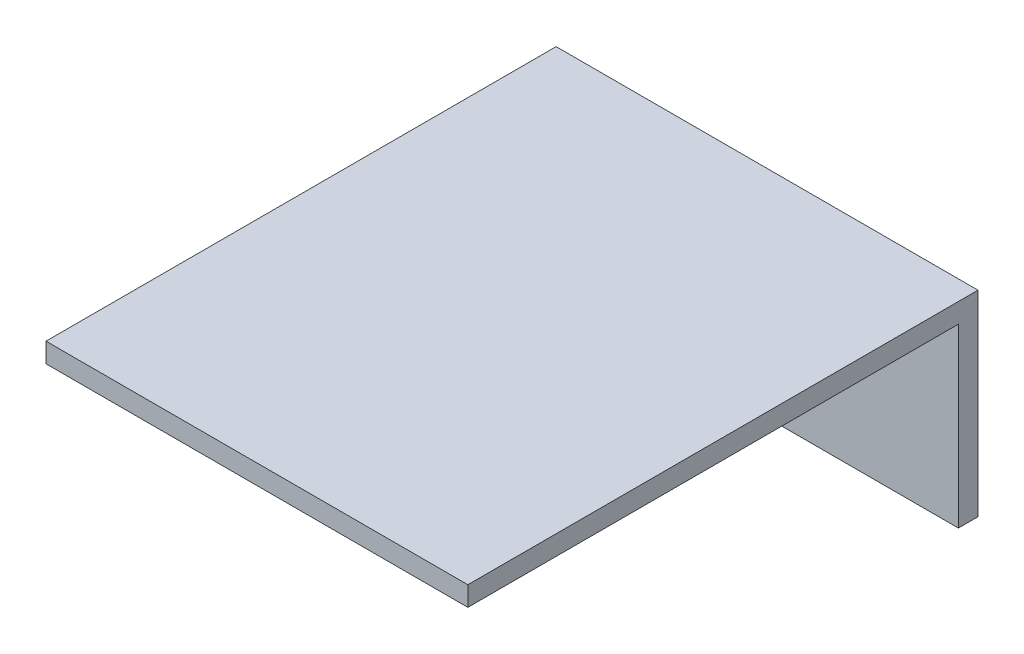
ISO-10303-21;
HEADER;
FILE_DESCRIPTION(('STEP AP214'),'2;1');
FILE_NAME('part.step','',(''),(''),'','','');
FILE_SCHEMA(('AUTOMOTIVE_DESIGN { 1 0 10303 214 1 1 1 1 }'));
ENDSEC;
DATA;
#1=APPLICATION_CONTEXT('core data for automotive mechanical design processes');
#2=APPLICATION_PROTOCOL_DEFINITION('international standard','automotive_design',2000,#1);
#3=PRODUCT_CONTEXT('',#1,'mechanical');
#4=PRODUCT('Part','Part','',(#3));
#5=PRODUCT_RELATED_PRODUCT_CATEGORY('part','',(#4));
#6=PRODUCT_DEFINITION_FORMATION('','',#4);
#7=PRODUCT_DEFINITION_CONTEXT('part definition',#1,'design');
#8=PRODUCT_DEFINITION('design','',#6,#7);
#9=PRODUCT_DEFINITION_SHAPE('','',#8);
#10=(LENGTH_UNIT() NAMED_UNIT(*) SI_UNIT(.MILLI.,.METRE.));
#11=(NAMED_UNIT(*) PLANE_ANGLE_UNIT() SI_UNIT($,.RADIAN.));
#12=(NAMED_UNIT(*) SI_UNIT($,.STERADIAN.) SOLID_ANGLE_UNIT());
#13=UNCERTAINTY_MEASURE_WITH_UNIT(LENGTH_MEASURE(1.E-05),#10,'distance_accuracy_value','');
#14=(GEOMETRIC_REPRESENTATION_CONTEXT(3) GLOBAL_UNCERTAINTY_ASSIGNED_CONTEXT((#13)) GLOBAL_UNIT_ASSIGNED_CONTEXT((#10,
#11,#12)) REPRESENTATION_CONTEXT('',''));
#15=CARTESIAN_POINT('',(0.,0.,0.));
#16=DIRECTION('',(0.,0.,1.));
#17=DIRECTION('',(1.,0.,0.));
#18=AXIS2_PLACEMENT_3D('',#15,#16,#17);
#19=CARTESIAN_POINT('',(-21.5,-10.,52.));
#20=DIRECTION('',(0.,1.,0.));
#21=DIRECTION('',(0.,0.,1.));
#22=AXIS2_PLACEMENT_3D('',#19,#20,#21);
#23=PLANE('',#22);
#24=DIRECTION('',(1.,0.,0.));
#25=VECTOR('',#24,1.);
#26=CARTESIAN_POINT('',(-21.5,-10.,1.99999999999999));
#27=LINE('',#26,#25);
#28=CARTESIAN_POINT('',(-21.5,-10.,1.99999999999999));
#29=VERTEX_POINT('',#28);
#30=CARTESIAN_POINT('',(21.5,-10.,1.99999999999999));
#31=VERTEX_POINT('',#30);
#32=EDGE_CURVE('E11',#29,#31,#27,.T.);
#33=ORIENTED_EDGE('',*,*,#32,.F.);
#34=DIRECTION('',(0.,0.,-1.));
#35=VECTOR('',#34,1.);
#36=CARTESIAN_POINT('',(-21.5,-10.,52.));
#37=LINE('',#36,#35);
#38=CARTESIAN_POINT('',(-21.5,-10.,0.));
#39=VERTEX_POINT('',#38);
#40=EDGE_CURVE('E87',#29,#39,#37,.T.);
#41=ORIENTED_EDGE('',*,*,#40,.T.);
#42=DIRECTION('',(1.,0.,0.));
#43=VECTOR('',#42,1.);
#44=CARTESIAN_POINT('',(-21.5,-10.,0.));
#45=LINE('',#44,#43);
#46=CARTESIAN_POINT('',(21.5,-10.,0.));
#47=VERTEX_POINT('',#46);
#48=EDGE_CURVE('E91',#39,#47,#45,.T.);
#49=ORIENTED_EDGE('',*,*,#48,.T.);
#50=DIRECTION('',(0.,0.,-1.));
#51=VECTOR('',#50,1.);
#52=CARTESIAN_POINT('',(21.5,-10.,52.));
#53=LINE('',#52,#51);
#54=EDGE_CURVE('E77',#31,#47,#53,.T.);
#55=ORIENTED_EDGE('',*,*,#54,.F.);
#56=EDGE_LOOP('',(#33,#41,#49,#55));
#57=FACE_BOUND('',#56,.T.);
#58=ADVANCED_FACE('F33',(#57),#23,.F.);
#59=CARTESIAN_POINT('',(21.5,-10.,52.));
#60=DIRECTION('',(-1.,0.,0.));
#61=DIRECTION('',(0.,0.,1.));
#62=AXIS2_PLACEMENT_3D('',#59,#60,#61);
#63=PLANE('',#62);
#64=DIRECTION('',(0.,1.,0.));
#65=VECTOR('',#64,1.);
#66=CARTESIAN_POINT('',(21.5,-10.,52.));
#67=LINE('',#66,#65);
#68=CARTESIAN_POINT('',(21.5,8.,52.));
#69=VERTEX_POINT('',#68);
#70=CARTESIAN_POINT('',(21.5,10.,52.));
#71=VERTEX_POINT('',#70);
#72=EDGE_CURVE('E96',#69,#71,#67,.T.);
#73=ORIENTED_EDGE('',*,*,#72,.F.);
#74=DIRECTION('',(0.,0.,-1.));
#75=VECTOR('',#74,1.);
#76=CARTESIAN_POINT('',(21.5,8.,52.));
#77=LINE('',#76,#75);
#78=CARTESIAN_POINT('',(21.5,8.,1.99999999999999));
#79=VERTEX_POINT('',#78);
#80=EDGE_CURVE('E48',#69,#79,#77,.T.);
#81=ORIENTED_EDGE('',*,*,#80,.T.);
#82=DIRECTION('',(0.,1.,0.));
#83=VECTOR('',#82,1.);
#84=CARTESIAN_POINT('',(21.5,-10.,1.99999999999999));
#85=LINE('',#84,#83);
#86=EDGE_CURVE('E84',#31,#79,#85,.T.);
#87=ORIENTED_EDGE('',*,*,#86,.F.);
#88=ORIENTED_EDGE('',*,*,#54,.T.);
#89=DIRECTION('',(0.,1.,0.));
#90=VECTOR('',#89,1.);
#91=CARTESIAN_POINT('',(21.5,-10.,0.));
#92=LINE('',#91,#90);
#93=CARTESIAN_POINT('',(21.5,10.,0.));
#94=VERTEX_POINT('',#93);
#95=EDGE_CURVE('E82',#47,#94,#92,.T.);
#96=ORIENTED_EDGE('',*,*,#95,.T.);
#97=DIRECTION('',(0.,0.,-1.));
#98=VECTOR('',#97,1.);
#99=CARTESIAN_POINT('',(21.5,10.,52.));
#100=LINE('',#99,#98);
#101=EDGE_CURVE('E114',#71,#94,#100,.T.);
#102=ORIENTED_EDGE('',*,*,#101,.F.);
#103=EDGE_LOOP('',(#73,#81,#87,#88,#96,#102));
#104=FACE_BOUND('',#103,.T.);
#105=ADVANCED_FACE('F35',(#104),#63,.F.);
#106=CARTESIAN_POINT('',(-21.5,10.,52.));
#107=DIRECTION('',(0.,-1.,0.));
#108=DIRECTION('',(0.,0.,-1.));
#109=AXIS2_PLACEMENT_3D('',#106,#107,#108);
#110=PLANE('',#109);
#111=DIRECTION('',(-1.,0.,0.));
#112=VECTOR('',#111,1.);
#113=CARTESIAN_POINT('',(-21.5,10.,0.));
#114=LINE('',#113,#112);
#115=CARTESIAN_POINT('',(-21.5,10.,0.));
#116=VERTEX_POINT('',#115);
#117=EDGE_CURVE('E100',#94,#116,#114,.T.);
#118=ORIENTED_EDGE('',*,*,#117,.T.);
#119=DIRECTION('',(0.,0.,-1.));
#120=VECTOR('',#119,1.);
#121=CARTESIAN_POINT('',(-21.5,10.,52.));
#122=LINE('',#121,#120);
#123=CARTESIAN_POINT('',(-21.5,10.,52.));
#124=VERTEX_POINT('',#123);
#125=EDGE_CURVE('E111',#124,#116,#122,.T.);
#126=ORIENTED_EDGE('',*,*,#125,.F.);
#127=DIRECTION('',(-1.,0.,0.));
#128=VECTOR('',#127,1.);
#129=CARTESIAN_POINT('',(-21.5,10.,52.));
#130=LINE('',#129,#128);
#131=EDGE_CURVE('E57',#71,#124,#130,.T.);
#132=ORIENTED_EDGE('',*,*,#131,.F.);
#133=ORIENTED_EDGE('',*,*,#101,.T.);
#134=EDGE_LOOP('',(#118,#126,#132,#133));
#135=FACE_BOUND('',#134,.T.);
#136=ADVANCED_FACE('F142',(#135),#110,.F.);
#137=CARTESIAN_POINT('',(-21.5,-10.,52.));
#138=DIRECTION('',(1.,0.,0.));
#139=DIRECTION('',(0.,0.,-1.));
#140=AXIS2_PLACEMENT_3D('',#137,#138,#139);
#141=PLANE('',#140);
#142=DIRECTION('',(0.,-1.,0.));
#143=VECTOR('',#142,1.);
#144=CARTESIAN_POINT('',(-21.5,-10.,1.99999999999999));
#145=LINE('',#144,#143);
#146=CARTESIAN_POINT('',(-21.5,8.,1.99999999999999));
#147=VERTEX_POINT('',#146);
#148=EDGE_CURVE('E104',#147,#29,#145,.T.);
#149=ORIENTED_EDGE('',*,*,#148,.F.);
#150=DIRECTION('',(0.,0.,1.));
#151=VECTOR('',#150,1.);
#152=CARTESIAN_POINT('',(-21.5,8.,52.));
#153=LINE('',#152,#151);
#154=CARTESIAN_POINT('',(-21.5,8.,52.));
#155=VERTEX_POINT('',#154);
#156=EDGE_CURVE('E126',#147,#155,#153,.T.);
#157=ORIENTED_EDGE('',*,*,#156,.T.);
#158=DIRECTION('',(0.,-1.,0.));
#159=VECTOR('',#158,1.);
#160=CARTESIAN_POINT('',(-21.5,-10.,52.));
#161=LINE('',#160,#159);
#162=EDGE_CURVE('E88',#124,#155,#161,.T.);
#163=ORIENTED_EDGE('',*,*,#162,.F.);
#164=ORIENTED_EDGE('',*,*,#125,.T.);
#165=DIRECTION('',(0.,-1.,0.));
#166=VECTOR('',#165,1.);
#167=CARTESIAN_POINT('',(-21.5,-10.,0.));
#168=LINE('',#167,#166);
#169=EDGE_CURVE('E97',#116,#39,#168,.T.);
#170=ORIENTED_EDGE('',*,*,#169,.T.);
#171=ORIENTED_EDGE('',*,*,#40,.F.);
#172=EDGE_LOOP('',(#149,#157,#163,#164,#170,#171));
#173=FACE_BOUND('',#172,.T.);
#174=ADVANCED_FACE('F137',(#173),#141,.F.);
#175=CARTESIAN_POINT('',(0.,0.,52.));
#176=DIRECTION('',(0.,0.,-1.));
#177=DIRECTION('',(-1.,0.,0.));
#178=AXIS2_PLACEMENT_3D('',#175,#176,#177);
#179=PLANE('',#178);
#180=ORIENTED_EDGE('',*,*,#162,.T.);
#181=DIRECTION('',(1.,0.,0.));
#182=VECTOR('',#181,1.);
#183=CARTESIAN_POINT('',(0.,8.,52.));
#184=LINE('',#183,#182);
#185=EDGE_CURVE('E41',#155,#69,#184,.T.);
#186=ORIENTED_EDGE('',*,*,#185,.T.);
#187=ORIENTED_EDGE('',*,*,#72,.T.);
#188=ORIENTED_EDGE('',*,*,#131,.T.);
#189=EDGE_LOOP('',(#180,#186,#187,#188));
#190=FACE_BOUND('',#189,.T.);
#191=ADVANCED_FACE('F115',(#190),#179,.F.);
#192=CARTESIAN_POINT('',(0.,0.,0.));
#193=DIRECTION('',(0.,0.,-1.));
#194=DIRECTION('',(-1.,0.,0.));
#195=AXIS2_PLACEMENT_3D('',#192,#193,#194);
#196=PLANE('',#195);
#197=ORIENTED_EDGE('',*,*,#95,.F.);
#198=ORIENTED_EDGE('',*,*,#48,.F.);
#199=ORIENTED_EDGE('',*,*,#169,.F.);
#200=ORIENTED_EDGE('',*,*,#117,.F.);
#201=EDGE_LOOP('',(#197,#198,#199,#200));
#202=FACE_BOUND('',#201,.T.);
#203=ADVANCED_FACE('F99',(#202),#196,.T.);
#204=CARTESIAN_POINT('',(0.,0.,1.99999999999999));
#205=DIRECTION('',(0.,0.,1.));
#206=DIRECTION('',(1.,0.,0.));
#207=AXIS2_PLACEMENT_3D('',#204,#205,#206);
#208=PLANE('',#207);
#209=ORIENTED_EDGE('',*,*,#86,.T.);
#210=DIRECTION('',(-1.,0.,0.));
#211=VECTOR('',#210,1.);
#212=CARTESIAN_POINT('',(30.2088614005527,8.,1.99999999999999));
#213=LINE('',#212,#211);
#214=EDGE_CURVE('E128',#79,#147,#213,.T.);
#215=ORIENTED_EDGE('',*,*,#214,.T.);
#216=ORIENTED_EDGE('',*,*,#148,.T.);
#217=ORIENTED_EDGE('',*,*,#32,.T.);
#218=EDGE_LOOP('',(#209,#215,#216,#217));
#219=FACE_BOUND('',#218,.T.);
#220=ADVANCED_FACE('F133',(#219),#208,.T.);
#221=CARTESIAN_POINT('',(30.2088614005527,8.,1.99999999999999));
#222=DIRECTION('',(0.,1.,0.));
#223=DIRECTION('',(0.,0.,1.));
#224=AXIS2_PLACEMENT_3D('',#221,#222,#223);
#225=PLANE('',#224);
#226=ORIENTED_EDGE('',*,*,#185,.F.);
#227=ORIENTED_EDGE('',*,*,#156,.F.);
#228=ORIENTED_EDGE('',*,*,#214,.F.);
#229=ORIENTED_EDGE('',*,*,#80,.F.);
#230=EDGE_LOOP('',(#226,#227,#228,#229));
#231=FACE_BOUND('',#230,.T.);
#232=ADVANCED_FACE('F158',(#231),#225,.F.);
#233=CLOSED_SHELL('',(#58,#105,#136,#174,#191,#203,#220,#232));
#234=MANIFOLD_SOLID_BREP('B2',#233);
#235=ADVANCED_BREP_SHAPE_REPRESENTATION('',(#18,#234),#14);
#236=SHAPE_DEFINITION_REPRESENTATION(#9,#235);
ENDSEC;
END-ISO-10303-21;
